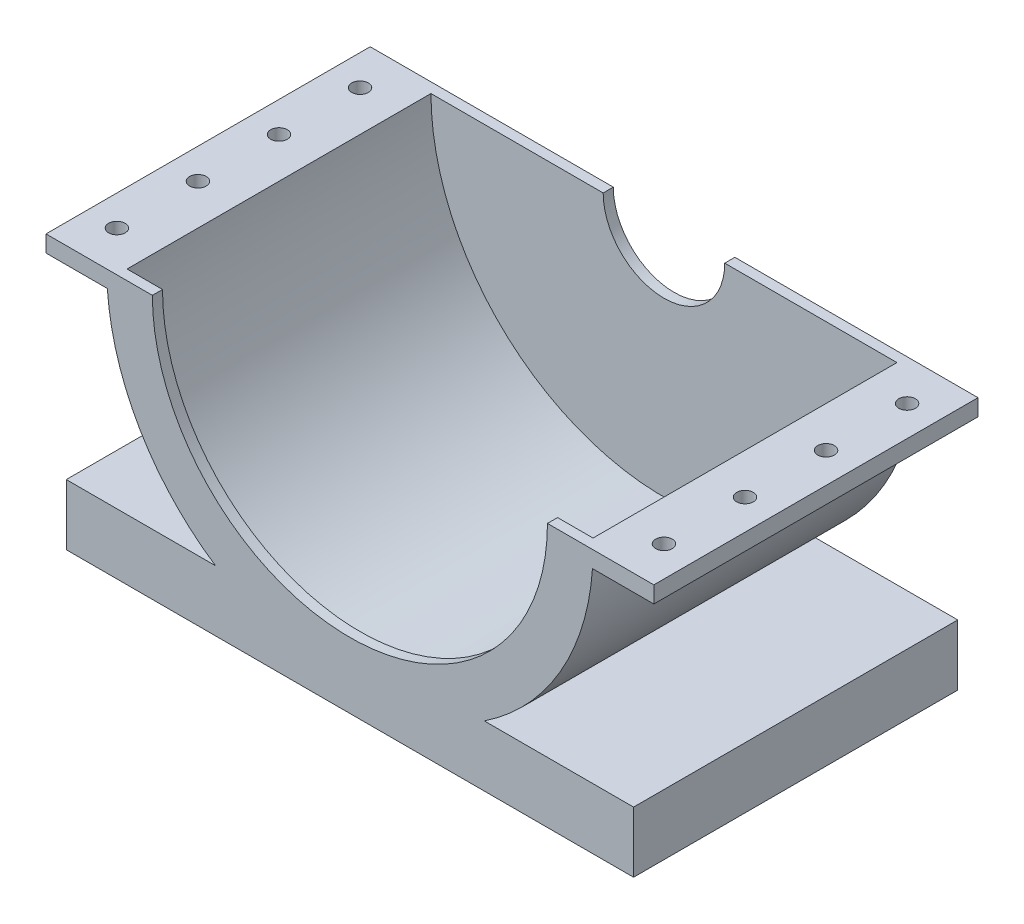
ISO-10303-21;
HEADER;
FILE_DESCRIPTION(('STEP AP214'),'2;1');
FILE_NAME('part.step','',(''),(''),'','','');
FILE_SCHEMA(('AUTOMOTIVE_DESIGN { 1 0 10303 214 1 1 1 1 }'));
ENDSEC;
DATA;
#1=APPLICATION_CONTEXT('core data for automotive mechanical design processes');
#2=APPLICATION_PROTOCOL_DEFINITION('international standard','automotive_design',2000,#1);
#3=PRODUCT_CONTEXT('',#1,'mechanical');
#4=PRODUCT('Part','Part','',(#3));
#5=PRODUCT_RELATED_PRODUCT_CATEGORY('part','',(#4));
#6=PRODUCT_DEFINITION_FORMATION('','',#4);
#7=PRODUCT_DEFINITION_CONTEXT('part definition',#1,'design');
#8=PRODUCT_DEFINITION('design','',#6,#7);
#9=PRODUCT_DEFINITION_SHAPE('','',#8);
#10=(LENGTH_UNIT() NAMED_UNIT(*) SI_UNIT(.MILLI.,.METRE.));
#11=(NAMED_UNIT(*) PLANE_ANGLE_UNIT() SI_UNIT($,.RADIAN.));
#12=(NAMED_UNIT(*) SI_UNIT($,.STERADIAN.) SOLID_ANGLE_UNIT());
#13=UNCERTAINTY_MEASURE_WITH_UNIT(LENGTH_MEASURE(1.E-05),#10,'distance_accuracy_value','');
#14=(GEOMETRIC_REPRESENTATION_CONTEXT(3) GLOBAL_UNCERTAINTY_ASSIGNED_CONTEXT((#13)) GLOBAL_UNIT_ASSIGNED_CONTEXT((#10,
#11,#12)) REPRESENTATION_CONTEXT('',''));
#15=CARTESIAN_POINT('',(0.,0.,0.));
#16=DIRECTION('',(0.,0.,1.));
#17=DIRECTION('',(1.,0.,0.));
#18=AXIS2_PLACEMENT_3D('',#15,#16,#17);
#19=CARTESIAN_POINT('',(0.,146.05,101.6));
#20=DIRECTION('',(0.,-1.,0.));
#21=DIRECTION('',(0.,0.,-1.));
#22=AXIS2_PLACEMENT_3D('',#19,#20,#21);
#23=PLANE('',#22);
#24=CARTESIAN_POINT('',(171.45,146.05,76.2));
#25=DIRECTION('',(0.,1.,0.));
#26=DIRECTION('',(0.,0.,-1.));
#27=AXIS2_PLACEMENT_3D('',#24,#25,#26);
#28=CIRCLE('',#27,5.20699999999998);
#29=CARTESIAN_POINT('',(171.45,146.05,70.993));
#30=VERTEX_POINT('',#29);
#31=EDGE_CURVE('E463',#30,#30,#28,.T.);
#32=ORIENTED_EDGE('',*,*,#31,.F.);
#33=EDGE_LOOP('',(#32));
#34=FACE_BOUND('',#33,.T.);
#35=CARTESIAN_POINT('',(171.45,146.05,25.4));
#36=DIRECTION('',(0.,1.,0.));
#37=DIRECTION('',(0.,0.,-1.));
#38=AXIS2_PLACEMENT_3D('',#35,#36,#37);
#39=CIRCLE('',#38,5.20699999999998);
#40=CARTESIAN_POINT('',(171.45,146.05,20.193));
#41=VERTEX_POINT('',#40);
#42=EDGE_CURVE('E468',#41,#41,#39,.T.);
#43=ORIENTED_EDGE('',*,*,#42,.F.);
#44=EDGE_LOOP('',(#43));
#45=FACE_BOUND('',#44,.T.);
#46=CARTESIAN_POINT('',(171.45,146.05,-25.4));
#47=DIRECTION('',(0.,1.,0.));
#48=DIRECTION('',(0.,0.,-1.));
#49=AXIS2_PLACEMENT_3D('',#46,#47,#48);
#50=CIRCLE('',#49,5.20699999999998);
#51=CARTESIAN_POINT('',(171.45,146.05,-30.607));
#52=VERTEX_POINT('',#51);
#53=EDGE_CURVE('E482',#52,#52,#50,.T.);
#54=ORIENTED_EDGE('',*,*,#53,.F.);
#55=EDGE_LOOP('',(#54));
#56=FACE_BOUND('',#55,.T.);
#57=CARTESIAN_POINT('',(171.45,146.05,-76.2));
#58=DIRECTION('',(0.,1.,0.));
#59=DIRECTION('',(0.,0.,-1.));
#60=AXIS2_PLACEMENT_3D('',#57,#58,#59);
#61=CIRCLE('',#60,5.20699999999998);
#62=CARTESIAN_POINT('',(171.45,146.05,-81.407));
#63=VERTEX_POINT('',#62);
#64=EDGE_CURVE('E478',#63,#63,#61,.T.);
#65=ORIENTED_EDGE('',*,*,#64,.F.);
#66=EDGE_LOOP('',(#65));
#67=FACE_BOUND('',#66,.T.);
#68=DIRECTION('',(-1.,0.,0.));
#69=VECTOR('',#68,1.);
#70=CARTESIAN_POINT('',(0.,146.05,-101.6));
#71=LINE('',#70,#69);
#72=CARTESIAN_POINT('',(190.5,146.05,-101.6));
#73=VERTEX_POINT('',#72);
#74=CARTESIAN_POINT('',(38.1,146.05,-101.6));
#75=VERTEX_POINT('',#74);
#76=EDGE_CURVE('E182',#73,#75,#71,.T.);
#77=ORIENTED_EDGE('',*,*,#76,.T.);
#78=DIRECTION('',(0.,0.,1.));
#79=VECTOR('',#78,1.);
#80=CARTESIAN_POINT('',(38.1,146.05,-101.6));
#81=LINE('',#80,#79);
#82=CARTESIAN_POINT('',(38.1,146.05,-95.25));
#83=VERTEX_POINT('',#82);
#84=EDGE_CURVE('E166',#75,#83,#81,.T.);
#85=ORIENTED_EDGE('',*,*,#84,.T.);
#86=DIRECTION('',(-1.,0.,0.));
#87=VECTOR('',#86,1.);
#88=CARTESIAN_POINT('',(-146.05,146.05,-95.25));
#89=LINE('',#88,#87);
#90=CARTESIAN_POINT('',(146.05,146.05,-95.25));
#91=VERTEX_POINT('',#90);
#92=EDGE_CURVE('E430',#91,#83,#89,.T.);
#93=ORIENTED_EDGE('',*,*,#92,.F.);
#94=DIRECTION('',(0.,0.,1.));
#95=VECTOR('',#94,1.);
#96=CARTESIAN_POINT('',(146.05,146.05,-95.25));
#97=LINE('',#96,#95);
#98=CARTESIAN_POINT('',(146.05,146.05,95.25));
#99=VERTEX_POINT('',#98);
#100=EDGE_CURVE('E388',#91,#99,#97,.T.);
#101=ORIENTED_EDGE('',*,*,#100,.T.);
#102=DIRECTION('',(-1.,0.,0.));
#103=VECTOR('',#102,1.);
#104=CARTESIAN_POINT('',(-146.05,146.05,95.25));
#105=LINE('',#104,#103);
#106=CARTESIAN_POINT('',(123.825,146.05,95.25));
#107=VERTEX_POINT('',#106);
#108=EDGE_CURVE('E432',#99,#107,#105,.T.);
#109=ORIENTED_EDGE('',*,*,#108,.T.);
#110=DIRECTION('',(0.,0.,1.));
#111=VECTOR('',#110,1.);
#112=CARTESIAN_POINT('',(123.825,146.05,-101.601));
#113=LINE('',#112,#111);
#114=CARTESIAN_POINT('',(123.825,146.05,101.6));
#115=VERTEX_POINT('',#114);
#116=EDGE_CURVE('E66',#115,#107,#113,.F.);
#117=ORIENTED_EDGE('',*,*,#116,.F.);
#118=DIRECTION('',(-1.,0.,0.));
#119=VECTOR('',#118,1.);
#120=CARTESIAN_POINT('',(0.,146.05,101.6));
#121=LINE('',#120,#119);
#122=CARTESIAN_POINT('',(190.5,146.05,101.6));
#123=VERTEX_POINT('',#122);
#124=EDGE_CURVE('E393',#123,#115,#121,.T.);
#125=ORIENTED_EDGE('',*,*,#124,.F.);
#126=DIRECTION('',(0.,0.,-1.));
#127=VECTOR('',#126,1.);
#128=CARTESIAN_POINT('',(190.5,146.05,101.6));
#129=LINE('',#128,#127);
#130=EDGE_CURVE('E189',#123,#73,#129,.T.);
#131=ORIENTED_EDGE('',*,*,#130,.T.);
#132=EDGE_LOOP('',(#77,#85,#93,#101,#109,#117,#125,#131));
#133=FACE_BOUND('',#132,.T.);
#134=ADVANCED_FACE('F41',(#34,#45,#56,#67,#133),#23,.F.);
#135=CARTESIAN_POINT('',(-171.45,146.05,-25.4));
#136=DIRECTION('',(0.,1.,0.));
#137=DIRECTION('',(0.,0.,1.));
#138=AXIS2_PLACEMENT_3D('',#135,#136,#137);
#139=CIRCLE('',#138,5.20699999999998);
#140=CARTESIAN_POINT('',(-171.45,146.05,-20.193));
#141=VERTEX_POINT('',#140);
#142=EDGE_CURVE('E462',#141,#141,#139,.T.);
#143=ORIENTED_EDGE('',*,*,#142,.F.);
#144=EDGE_LOOP('',(#143));
#145=FACE_BOUND('',#144,.T.);
#146=CARTESIAN_POINT('',(-171.45,146.05,25.4));
#147=DIRECTION('',(0.,1.,0.));
#148=DIRECTION('',(0.,0.,1.));
#149=AXIS2_PLACEMENT_3D('',#146,#147,#148);
#150=CIRCLE('',#149,5.20699999999998);
#151=CARTESIAN_POINT('',(-171.45,146.05,30.607));
#152=VERTEX_POINT('',#151);
#153=EDGE_CURVE('E472',#152,#152,#150,.T.);
#154=ORIENTED_EDGE('',*,*,#153,.F.);
#155=EDGE_LOOP('',(#154));
#156=FACE_BOUND('',#155,.T.);
#157=CARTESIAN_POINT('',(-171.45,146.05,76.2));
#158=DIRECTION('',(0.,1.,0.));
#159=DIRECTION('',(0.,0.,1.));
#160=AXIS2_PLACEMENT_3D('',#157,#158,#159);
#161=CIRCLE('',#160,5.20699999999998);
#162=CARTESIAN_POINT('',(-171.45,146.05,81.407));
#163=VERTEX_POINT('',#162);
#164=EDGE_CURVE('E467',#163,#163,#161,.T.);
#165=ORIENTED_EDGE('',*,*,#164,.F.);
#166=EDGE_LOOP('',(#165));
#167=FACE_BOUND('',#166,.T.);
#168=CARTESIAN_POINT('',(-171.45,146.05,-76.2));
#169=DIRECTION('',(0.,1.,0.));
#170=DIRECTION('',(0.,0.,1.));
#171=AXIS2_PLACEMENT_3D('',#168,#169,#170);
#172=CIRCLE('',#171,5.20699999999998);
#173=CARTESIAN_POINT('',(-171.45,146.05,-70.993));
#174=VERTEX_POINT('',#173);
#175=EDGE_CURVE('E248',#174,#174,#172,.T.);
#176=ORIENTED_EDGE('',*,*,#175,.F.);
#177=EDGE_LOOP('',(#176));
#178=FACE_BOUND('',#177,.T.);
#179=CARTESIAN_POINT('',(-38.1,146.05,-95.25));
#180=VERTEX_POINT('',#179);
#181=CARTESIAN_POINT('',(-146.05,146.05,-95.25));
#182=VERTEX_POINT('',#181);
#183=EDGE_CURVE('E444',#180,#182,#89,.T.);
#184=ORIENTED_EDGE('',*,*,#183,.F.);
#185=DIRECTION('',(0.,0.,1.));
#186=VECTOR('',#185,1.);
#187=CARTESIAN_POINT('',(-38.1,146.05,-101.6));
#188=LINE('',#187,#186);
#189=CARTESIAN_POINT('',(-38.1,146.05,-101.6));
#190=VERTEX_POINT('',#189);
#191=EDGE_CURVE('E58',#180,#190,#188,.F.);
#192=ORIENTED_EDGE('',*,*,#191,.T.);
#193=CARTESIAN_POINT('',(-190.5,146.05,-101.6));
#194=VERTEX_POINT('',#193);
#195=EDGE_CURVE('E185',#190,#194,#71,.T.);
#196=ORIENTED_EDGE('',*,*,#195,.T.);
#197=DIRECTION('',(0.,0.,-1.));
#198=VECTOR('',#197,1.);
#199=CARTESIAN_POINT('',(-190.5,146.05,101.6));
#200=LINE('',#199,#198);
#201=CARTESIAN_POINT('',(-190.5,146.05,101.6));
#202=VERTEX_POINT('',#201);
#203=EDGE_CURVE('E205',#202,#194,#200,.T.);
#204=ORIENTED_EDGE('',*,*,#203,.F.);
#205=CARTESIAN_POINT('',(-123.825,146.05,101.6));
#206=VERTEX_POINT('',#205);
#207=EDGE_CURVE('E397',#206,#202,#121,.T.);
#208=ORIENTED_EDGE('',*,*,#207,.F.);
#209=DIRECTION('',(0.,0.,1.));
#210=VECTOR('',#209,1.);
#211=CARTESIAN_POINT('',(-123.825,146.05,-101.601));
#212=LINE('',#211,#210);
#213=CARTESIAN_POINT('',(-123.825,146.05,95.25));
#214=VERTEX_POINT('',#213);
#215=EDGE_CURVE('E175',#214,#206,#212,.T.);
#216=ORIENTED_EDGE('',*,*,#215,.F.);
#217=CARTESIAN_POINT('',(-146.05,146.05,95.25));
#218=VERTEX_POINT('',#217);
#219=EDGE_CURVE('E437',#214,#218,#105,.T.);
#220=ORIENTED_EDGE('',*,*,#219,.T.);
#221=DIRECTION('',(0.,0.,1.));
#222=VECTOR('',#221,1.);
#223=CARTESIAN_POINT('',(-146.05,146.05,-95.25));
#224=LINE('',#223,#222);
#225=EDGE_CURVE('E382',#182,#218,#224,.T.);
#226=ORIENTED_EDGE('',*,*,#225,.F.);
#227=EDGE_LOOP('',(#184,#192,#196,#204,#208,#216,#220,#226));
#228=FACE_BOUND('',#227,.T.);
#229=ADVANCED_FACE('F291',(#145,#156,#167,#178,#228),#23,.F.);
#230=CARTESIAN_POINT('',(0.,135.636,101.6));
#231=DIRECTION('',(0.,1.,0.));
#232=DIRECTION('',(0.,0.,1.));
#233=AXIS2_PLACEMENT_3D('',#230,#231,#232);
#234=PLANE('',#233);
#235=CARTESIAN_POINT('',(-171.45,135.636,-25.4));
#236=DIRECTION('',(0.,1.,0.));
#237=DIRECTION('',(0.,0.,1.));
#238=AXIS2_PLACEMENT_3D('',#235,#236,#237);
#239=CIRCLE('',#238,5.20699999999998);
#240=CARTESIAN_POINT('',(-171.45,135.636,-20.193));
#241=VERTEX_POINT('',#240);
#242=EDGE_CURVE('E45',#241,#241,#239,.T.);
#243=ORIENTED_EDGE('',*,*,#242,.T.);
#244=EDGE_LOOP('',(#243));
#245=FACE_BOUND('',#244,.T.);
#246=CARTESIAN_POINT('',(-171.45,135.636,25.4));
#247=DIRECTION('',(0.,1.,0.));
#248=DIRECTION('',(0.,0.,1.));
#249=AXIS2_PLACEMENT_3D('',#246,#247,#248);
#250=CIRCLE('',#249,5.20699999999998);
#251=CARTESIAN_POINT('',(-171.45,135.636,30.607));
#252=VERTEX_POINT('',#251);
#253=EDGE_CURVE('E267',#252,#252,#250,.T.);
#254=ORIENTED_EDGE('',*,*,#253,.T.);
#255=EDGE_LOOP('',(#254));
#256=FACE_BOUND('',#255,.T.);
#257=CARTESIAN_POINT('',(-171.45,135.636,76.2));
#258=DIRECTION('',(0.,1.,0.));
#259=DIRECTION('',(0.,0.,1.));
#260=AXIS2_PLACEMENT_3D('',#257,#258,#259);
#261=CIRCLE('',#260,5.20699999999998);
#262=CARTESIAN_POINT('',(-171.45,135.636,81.407));
#263=VERTEX_POINT('',#262);
#264=EDGE_CURVE('E264',#263,#263,#261,.T.);
#265=ORIENTED_EDGE('',*,*,#264,.T.);
#266=EDGE_LOOP('',(#265));
#267=FACE_BOUND('',#266,.T.);
#268=CARTESIAN_POINT('',(-171.45,135.636,-76.2));
#269=DIRECTION('',(0.,1.,0.));
#270=DIRECTION('',(0.,0.,1.));
#271=AXIS2_PLACEMENT_3D('',#268,#269,#270);
#272=CIRCLE('',#271,5.20699999999998);
#273=CARTESIAN_POINT('',(-171.45,135.636,-70.993));
#274=VERTEX_POINT('',#273);
#275=EDGE_CURVE('E260',#274,#274,#272,.T.);
#276=ORIENTED_EDGE('',*,*,#275,.T.);
#277=EDGE_LOOP('',(#276));
#278=FACE_BOUND('',#277,.T.);
#279=DIRECTION('',(1.,0.,0.));
#280=VECTOR('',#279,1.);
#281=CARTESIAN_POINT('',(0.,135.636,-101.6));
#282=LINE('',#281,#280);
#283=CARTESIAN_POINT('',(-190.5,135.636,-101.6));
#284=VERTEX_POINT('',#283);
#285=CARTESIAN_POINT('',(-152.04377200004,135.636,-101.6));
#286=VERTEX_POINT('',#285);
#287=EDGE_CURVE('E379',#284,#286,#282,.T.);
#288=ORIENTED_EDGE('',*,*,#287,.T.);
#289=DIRECTION('',(0.,0.,-1.));
#290=VECTOR('',#289,1.);
#291=CARTESIAN_POINT('',(-152.04377200004,135.636,101.6));
#292=LINE('',#291,#290);
#293=CARTESIAN_POINT('',(-152.04377200004,135.636,101.6));
#294=VERTEX_POINT('',#293);
#295=EDGE_CURVE('E51',#294,#286,#292,.T.);
#296=ORIENTED_EDGE('',*,*,#295,.F.);
#297=DIRECTION('',(1.,0.,0.));
#298=VECTOR('',#297,1.);
#299=CARTESIAN_POINT('',(0.,135.636,101.6));
#300=LINE('',#299,#298);
#301=CARTESIAN_POINT('',(-190.5,135.636,101.6));
#302=VERTEX_POINT('',#301);
#303=EDGE_CURVE('E195',#302,#294,#300,.T.);
#304=ORIENTED_EDGE('',*,*,#303,.F.);
#305=DIRECTION('',(0.,0.,-1.));
#306=VECTOR('',#305,1.);
#307=CARTESIAN_POINT('',(-190.5,135.636,101.6));
#308=LINE('',#307,#306);
#309=EDGE_CURVE('E201',#302,#284,#308,.T.);
#310=ORIENTED_EDGE('',*,*,#309,.T.);
#311=EDGE_LOOP('',(#288,#296,#304,#310));
#312=FACE_BOUND('',#311,.T.);
#313=ADVANCED_FACE('F43',(#245,#256,#267,#278,#312),#234,.F.);
#314=CARTESIAN_POINT('',(0.,146.05,101.6));
#315=DIRECTION('',(0.,0.,-1.));
#316=DIRECTION('',(-1.,0.,0.));
#317=AXIS2_PLACEMENT_3D('',#314,#315,#316);
#318=CYLINDRICAL_SURFACE('',#317,152.4);
#319=CARTESIAN_POINT('',(0.,146.05,-101.6));
#320=DIRECTION('',(0.,0.,1.));
#321=DIRECTION('',(1.,0.,0.));
#322=AXIS2_PLACEMENT_3D('',#319,#320,#321);
#323=CIRCLE('',#322,152.4);
#324=CARTESIAN_POINT('',(-84.2422696750272,19.05,-101.6));
#325=VERTEX_POINT('',#324);
#326=EDGE_CURVE('E348',#286,#325,#323,.T.);
#327=ORIENTED_EDGE('',*,*,#326,.T.);
#328=DIRECTION('',(0.,0.,-1.));
#329=VECTOR('',#328,1.);
#330=CARTESIAN_POINT('',(-84.2422696750272,19.05,101.6));
#331=LINE('',#330,#329);
#332=CARTESIAN_POINT('',(-84.2422696750272,19.05,101.6));
#333=VERTEX_POINT('',#332);
#334=EDGE_CURVE('E236',#333,#325,#331,.T.);
#335=ORIENTED_EDGE('',*,*,#334,.F.);
#336=CARTESIAN_POINT('',(0.,146.05,101.6));
#337=DIRECTION('',(0.,0.,1.));
#338=DIRECTION('',(1.,0.,0.));
#339=AXIS2_PLACEMENT_3D('',#336,#337,#338);
#340=CIRCLE('',#339,152.4);
#341=EDGE_CURVE('E422',#294,#333,#340,.T.);
#342=ORIENTED_EDGE('',*,*,#341,.F.);
#343=ORIENTED_EDGE('',*,*,#295,.T.);
#344=EDGE_LOOP('',(#327,#335,#342,#343));
#345=FACE_BOUND('',#344,.T.);
#346=ADVANCED_FACE('F317',(#345),#318,.T.);
#347=CARTESIAN_POINT('',(0.,19.05,101.6));
#348=DIRECTION('',(0.,-1.,0.));
#349=DIRECTION('',(1.,0.,0.));
#350=AXIS2_PLACEMENT_3D('',#347,#348,#349);
#351=PLANE('',#350);
#352=DIRECTION('',(-1.,0.,0.));
#353=VECTOR('',#352,1.);
#354=CARTESIAN_POINT('',(0.,19.05,-101.6));
#355=LINE('',#354,#353);
#356=CARTESIAN_POINT('',(-177.8,19.05,-101.6));
#357=VERTEX_POINT('',#356);
#358=EDGE_CURVE('E341',#325,#357,#355,.T.);
#359=ORIENTED_EDGE('',*,*,#358,.T.);
#360=DIRECTION('',(0.,0.,-1.));
#361=VECTOR('',#360,1.);
#362=CARTESIAN_POINT('',(-177.8,19.05,101.6));
#363=LINE('',#362,#361);
#364=CARTESIAN_POINT('',(-177.8,19.05,101.6));
#365=VERTEX_POINT('',#364);
#366=EDGE_CURVE('E232',#365,#357,#363,.T.);
#367=ORIENTED_EDGE('',*,*,#366,.F.);
#368=DIRECTION('',(-1.,0.,0.));
#369=VECTOR('',#368,1.);
#370=CARTESIAN_POINT('',(0.,19.05,101.6));
#371=LINE('',#370,#369);
#372=EDGE_CURVE('E419',#333,#365,#371,.T.);
#373=ORIENTED_EDGE('',*,*,#372,.F.);
#374=ORIENTED_EDGE('',*,*,#334,.T.);
#375=EDGE_LOOP('',(#359,#367,#373,#374));
#376=FACE_BOUND('',#375,.T.);
#377=ADVANCED_FACE('F331',(#376),#351,.F.);
#378=CARTESIAN_POINT('',(-177.8,-1.29526019539602E-13,101.6));
#379=DIRECTION('',(1.,0.,0.));
#380=DIRECTION('',(0.,1.,0.));
#381=AXIS2_PLACEMENT_3D('',#378,#379,#380);
#382=PLANE('',#381);
#383=DIRECTION('',(0.,-1.,0.));
#384=VECTOR('',#383,1.);
#385=CARTESIAN_POINT('',(-177.8,-1.29526019539602E-13,-101.6));
#386=LINE('',#385,#384);
#387=CARTESIAN_POINT('',(-177.8,-19.05,-101.6));
#388=VERTEX_POINT('',#387);
#389=EDGE_CURVE('E347',#357,#388,#386,.T.);
#390=ORIENTED_EDGE('',*,*,#389,.T.);
#391=DIRECTION('',(0.,0.,-1.));
#392=VECTOR('',#391,1.);
#393=CARTESIAN_POINT('',(-177.8,-19.05,101.6));
#394=LINE('',#393,#392);
#395=CARTESIAN_POINT('',(-177.8,-19.05,101.6));
#396=VERTEX_POINT('',#395);
#397=EDGE_CURVE('E228',#396,#388,#394,.T.);
#398=ORIENTED_EDGE('',*,*,#397,.F.);
#399=DIRECTION('',(0.,-1.,0.));
#400=VECTOR('',#399,1.);
#401=CARTESIAN_POINT('',(-177.8,-1.29526019539602E-13,101.6));
#402=LINE('',#401,#400);
#403=EDGE_CURVE('E351',#365,#396,#402,.T.);
#404=ORIENTED_EDGE('',*,*,#403,.F.);
#405=ORIENTED_EDGE('',*,*,#366,.T.);
#406=EDGE_LOOP('',(#390,#398,#404,#405));
#407=FACE_BOUND('',#406,.T.);
#408=ADVANCED_FACE('F328',(#407),#382,.F.);
#409=CARTESIAN_POINT('',(0.,-19.05,101.6));
#410=DIRECTION('',(0.,1.,0.));
#411=DIRECTION('',(0.,0.,1.));
#412=AXIS2_PLACEMENT_3D('',#409,#410,#411);
#413=PLANE('',#412);
#414=DIRECTION('',(1.,0.,0.));
#415=VECTOR('',#414,1.);
#416=CARTESIAN_POINT('',(0.,-19.05,-101.6));
#417=LINE('',#416,#415);
#418=CARTESIAN_POINT('',(177.8,-19.05,-101.6));
#419=VERTEX_POINT('',#418);
#420=EDGE_CURVE('E355',#388,#419,#417,.T.);
#421=ORIENTED_EDGE('',*,*,#420,.T.);
#422=DIRECTION('',(0.,0.,-1.));
#423=VECTOR('',#422,1.);
#424=CARTESIAN_POINT('',(177.8,-19.05,101.6));
#425=LINE('',#424,#423);
#426=CARTESIAN_POINT('',(177.8,-19.05,101.6));
#427=VERTEX_POINT('',#426);
#428=EDGE_CURVE('E225',#427,#419,#425,.T.);
#429=ORIENTED_EDGE('',*,*,#428,.F.);
#430=DIRECTION('',(1.,0.,0.));
#431=VECTOR('',#430,1.);
#432=CARTESIAN_POINT('',(0.,-19.05,101.6));
#433=LINE('',#432,#431);
#434=EDGE_CURVE('E414',#396,#427,#433,.T.);
#435=ORIENTED_EDGE('',*,*,#434,.F.);
#436=ORIENTED_EDGE('',*,*,#397,.T.);
#437=EDGE_LOOP('',(#421,#429,#435,#436));
#438=FACE_BOUND('',#437,.T.);
#439=ADVANCED_FACE('F324',(#438),#413,.F.);
#440=CARTESIAN_POINT('',(177.8,-1.29526019539602E-13,101.6));
#441=DIRECTION('',(1.,0.,0.));
#442=DIRECTION('',(0.,1.,0.));
#443=AXIS2_PLACEMENT_3D('',#440,#441,#442);
#444=PLANE('',#443);
#445=DIRECTION('',(0.,-1.,0.));
#446=VECTOR('',#445,1.);
#447=CARTESIAN_POINT('',(177.8,-1.29526019539602E-13,-101.6));
#448=LINE('',#447,#446);
#449=CARTESIAN_POINT('',(177.8,19.05,-101.6));
#450=VERTEX_POINT('',#449);
#451=EDGE_CURVE('E359',#450,#419,#448,.T.);
#452=ORIENTED_EDGE('',*,*,#451,.F.);
#453=DIRECTION('',(0.,0.,-1.));
#454=VECTOR('',#453,1.);
#455=CARTESIAN_POINT('',(177.8,19.05,101.6));
#456=LINE('',#455,#454);
#457=CARTESIAN_POINT('',(177.8,19.05,101.6));
#458=VERTEX_POINT('',#457);
#459=EDGE_CURVE('E222',#458,#450,#456,.T.);
#460=ORIENTED_EDGE('',*,*,#459,.F.);
#461=DIRECTION('',(0.,-1.,0.));
#462=VECTOR('',#461,1.);
#463=CARTESIAN_POINT('',(177.8,-1.29526019539602E-13,101.6));
#464=LINE('',#463,#462);
#465=EDGE_CURVE('E410',#458,#427,#464,.T.);
#466=ORIENTED_EDGE('',*,*,#465,.T.);
#467=ORIENTED_EDGE('',*,*,#428,.T.);
#468=EDGE_LOOP('',(#452,#460,#466,#467));
#469=FACE_BOUND('',#468,.T.);
#470=ADVANCED_FACE('F320',(#469),#444,.T.);
#471=CARTESIAN_POINT('',(0.,19.05,101.6));
#472=DIRECTION('',(0.,-1.,0.));
#473=DIRECTION('',(1.,0.,0.));
#474=AXIS2_PLACEMENT_3D('',#471,#472,#473);
#475=PLANE('',#474);
#476=DIRECTION('',(-1.,0.,0.));
#477=VECTOR('',#476,1.);
#478=CARTESIAN_POINT('',(0.,19.05,-101.6));
#479=LINE('',#478,#477);
#480=CARTESIAN_POINT('',(84.2422696750271,19.05,-101.6));
#481=VERTEX_POINT('',#480);
#482=EDGE_CURVE('E365',#450,#481,#479,.T.);
#483=ORIENTED_EDGE('',*,*,#482,.T.);
#484=DIRECTION('',(0.,0.,-1.));
#485=VECTOR('',#484,1.);
#486=CARTESIAN_POINT('',(84.2422696750271,19.05,101.6));
#487=LINE('',#486,#485);
#488=CARTESIAN_POINT('',(84.2422696750271,19.05,101.6));
#489=VERTEX_POINT('',#488);
#490=EDGE_CURVE('E218',#489,#481,#487,.T.);
#491=ORIENTED_EDGE('',*,*,#490,.F.);
#492=DIRECTION('',(-1.,0.,0.));
#493=VECTOR('',#492,1.);
#494=CARTESIAN_POINT('',(0.,19.05,101.6));
#495=LINE('',#494,#493);
#496=EDGE_CURVE('E407',#458,#489,#495,.T.);
#497=ORIENTED_EDGE('',*,*,#496,.F.);
#498=ORIENTED_EDGE('',*,*,#459,.T.);
#499=EDGE_LOOP('',(#483,#491,#497,#498));
#500=FACE_BOUND('',#499,.T.);
#501=ADVANCED_FACE('F315',(#500),#475,.F.);
#502=CARTESIAN_POINT('',(152.043772000039,135.636,-101.6));
#503=VERTEX_POINT('',#502);
#504=EDGE_CURVE('E367',#481,#503,#323,.T.);
#505=ORIENTED_EDGE('',*,*,#504,.T.);
#506=DIRECTION('',(0.,0.,-1.));
#507=VECTOR('',#506,1.);
#508=CARTESIAN_POINT('',(152.043772000039,135.636,101.6));
#509=LINE('',#508,#507);
#510=CARTESIAN_POINT('',(152.043772000039,135.636,101.6));
#511=VERTEX_POINT('',#510);
#512=EDGE_CURVE('E215',#511,#503,#509,.T.);
#513=ORIENTED_EDGE('',*,*,#512,.F.);
#514=EDGE_CURVE('E406',#489,#511,#340,.T.);
#515=ORIENTED_EDGE('',*,*,#514,.F.);
#516=ORIENTED_EDGE('',*,*,#490,.T.);
#517=EDGE_LOOP('',(#505,#513,#515,#516));
#518=FACE_BOUND('',#517,.T.);
#519=ADVANCED_FACE('F311',(#518),#318,.T.);
#520=CARTESIAN_POINT('',(0.,135.636,101.6));
#521=DIRECTION('',(0.,-1.,0.));
#522=DIRECTION('',(1.,0.,0.));
#523=AXIS2_PLACEMENT_3D('',#520,#521,#522);
#524=PLANE('',#523);
#525=CARTESIAN_POINT('',(171.45,135.636,76.2));
#526=DIRECTION('',(0.,-1.,0.));
#527=DIRECTION('',(1.,0.,0.));
#528=AXIS2_PLACEMENT_3D('',#525,#526,#527);
#529=CIRCLE('',#528,5.20699999999998);
#530=CARTESIAN_POINT('',(176.657,135.636,76.2));
#531=VERTEX_POINT('',#530);
#532=EDGE_CURVE('E256',#531,#531,#529,.T.);
#533=ORIENTED_EDGE('',*,*,#532,.F.);
#534=EDGE_LOOP('',(#533));
#535=FACE_BOUND('',#534,.T.);
#536=CARTESIAN_POINT('',(171.45,135.636,25.4));
#537=DIRECTION('',(0.,-1.,0.));
#538=DIRECTION('',(1.,0.,0.));
#539=AXIS2_PLACEMENT_3D('',#536,#537,#538);
#540=CIRCLE('',#539,5.20699999999998);
#541=CARTESIAN_POINT('',(176.657,135.636,25.4));
#542=VERTEX_POINT('',#541);
#543=EDGE_CURVE('E252',#542,#542,#540,.T.);
#544=ORIENTED_EDGE('',*,*,#543,.F.);
#545=EDGE_LOOP('',(#544));
#546=FACE_BOUND('',#545,.T.);
#547=CARTESIAN_POINT('',(171.45,135.636,-25.4));
#548=DIRECTION('',(0.,-1.,0.));
#549=DIRECTION('',(1.,0.,0.));
#550=AXIS2_PLACEMENT_3D('',#547,#548,#549);
#551=CIRCLE('',#550,5.20699999999998);
#552=CARTESIAN_POINT('',(176.657,135.636,-25.4));
#553=VERTEX_POINT('',#552);
#554=EDGE_CURVE('E247',#553,#553,#551,.T.);
#555=ORIENTED_EDGE('',*,*,#554,.F.);
#556=EDGE_LOOP('',(#555));
#557=FACE_BOUND('',#556,.T.);
#558=CARTESIAN_POINT('',(171.45,135.636,-76.2));
#559=DIRECTION('',(0.,-1.,0.));
#560=DIRECTION('',(1.,0.,0.));
#561=AXIS2_PLACEMENT_3D('',#558,#559,#560);
#562=CIRCLE('',#561,5.20699999999998);
#563=CARTESIAN_POINT('',(176.657,135.636,-76.2));
#564=VERTEX_POINT('',#563);
#565=EDGE_CURVE('E243',#564,#564,#562,.T.);
#566=ORIENTED_EDGE('',*,*,#565,.F.);
#567=EDGE_LOOP('',(#566));
#568=FACE_BOUND('',#567,.T.);
#569=DIRECTION('',(-1.,0.,0.));
#570=VECTOR('',#569,1.);
#571=CARTESIAN_POINT('',(0.,135.636,-101.6));
#572=LINE('',#571,#570);
#573=CARTESIAN_POINT('',(190.5,135.636,-101.6));
#574=VERTEX_POINT('',#573);
#575=EDGE_CURVE('E368',#574,#503,#572,.T.);
#576=ORIENTED_EDGE('',*,*,#575,.F.);
#577=DIRECTION('',(0.,0.,-1.));
#578=VECTOR('',#577,1.);
#579=CARTESIAN_POINT('',(190.5,135.636,101.6));
#580=LINE('',#579,#578);
#581=CARTESIAN_POINT('',(190.5,135.636,101.6));
#582=VERTEX_POINT('',#581);
#583=EDGE_CURVE('E212',#582,#574,#580,.T.);
#584=ORIENTED_EDGE('',*,*,#583,.F.);
#585=DIRECTION('',(-1.,0.,0.));
#586=VECTOR('',#585,1.);
#587=CARTESIAN_POINT('',(0.,135.636,101.6));
#588=LINE('',#587,#586);
#589=EDGE_CURVE('E402',#582,#511,#588,.T.);
#590=ORIENTED_EDGE('',*,*,#589,.T.);
#591=ORIENTED_EDGE('',*,*,#512,.T.);
#592=EDGE_LOOP('',(#576,#584,#590,#591));
#593=FACE_BOUND('',#592,.T.);
#594=ADVANCED_FACE('F307',(#535,#546,#557,#568,#593),#524,.T.);
#595=CARTESIAN_POINT('',(190.5,0.,101.6));
#596=DIRECTION('',(1.,0.,0.));
#597=DIRECTION('',(0.,0.,-1.));
#598=AXIS2_PLACEMENT_3D('',#595,#596,#597);
#599=PLANE('',#598);
#600=DIRECTION('',(0.,-1.,0.));
#601=VECTOR('',#600,1.);
#602=CARTESIAN_POINT('',(190.5,0.,-101.6));
#603=LINE('',#602,#601);
#604=EDGE_CURVE('E197',#73,#574,#603,.T.);
#605=ORIENTED_EDGE('',*,*,#604,.F.);
#606=ORIENTED_EDGE('',*,*,#130,.F.);
#607=DIRECTION('',(0.,-1.,0.));
#608=VECTOR('',#607,1.);
#609=CARTESIAN_POINT('',(190.5,0.,101.6));
#610=LINE('',#609,#608);
#611=EDGE_CURVE('E398',#123,#582,#610,.T.);
#612=ORIENTED_EDGE('',*,*,#611,.T.);
#613=ORIENTED_EDGE('',*,*,#583,.T.);
#614=EDGE_LOOP('',(#605,#606,#612,#613));
#615=FACE_BOUND('',#614,.T.);
#616=ADVANCED_FACE('F304',(#615),#599,.T.);
#617=CARTESIAN_POINT('',(-190.5,0.,101.6));
#618=DIRECTION('',(1.,0.,0.));
#619=DIRECTION('',(0.,0.,-1.));
#620=AXIS2_PLACEMENT_3D('',#617,#618,#619);
#621=PLANE('',#620);
#622=DIRECTION('',(0.,-1.,0.));
#623=VECTOR('',#622,1.);
#624=CARTESIAN_POINT('',(-190.5,0.,-101.6));
#625=LINE('',#624,#623);
#626=EDGE_CURVE('E191',#194,#284,#625,.T.);
#627=ORIENTED_EDGE('',*,*,#626,.T.);
#628=ORIENTED_EDGE('',*,*,#309,.F.);
#629=DIRECTION('',(0.,-1.,0.));
#630=VECTOR('',#629,1.);
#631=CARTESIAN_POINT('',(-190.5,0.,101.6));
#632=LINE('',#631,#630);
#633=EDGE_CURVE('E206',#202,#302,#632,.T.);
#634=ORIENTED_EDGE('',*,*,#633,.F.);
#635=ORIENTED_EDGE('',*,*,#203,.T.);
#636=EDGE_LOOP('',(#627,#628,#634,#635));
#637=FACE_BOUND('',#636,.T.);
#638=ADVANCED_FACE('F302',(#637),#621,.F.);
#639=CARTESIAN_POINT('',(0.,0.,101.6));
#640=DIRECTION('',(0.,0.,1.));
#641=DIRECTION('',(1.,0.,0.));
#642=AXIS2_PLACEMENT_3D('',#639,#640,#641);
#643=PLANE('',#642);
#644=CARTESIAN_POINT('',(0.,146.05,101.6));
#645=DIRECTION('',(0.,0.,1.));
#646=DIRECTION('',(1.,0.,0.));
#647=AXIS2_PLACEMENT_3D('',#644,#645,#646);
#648=CIRCLE('',#647,123.825);
#649=EDGE_CURVE('E450',#206,#115,#648,.T.);
#650=ORIENTED_EDGE('',*,*,#649,.F.);
#651=ORIENTED_EDGE('',*,*,#207,.T.);
#652=ORIENTED_EDGE('',*,*,#633,.T.);
#653=ORIENTED_EDGE('',*,*,#303,.T.);
#654=ORIENTED_EDGE('',*,*,#341,.T.);
#655=ORIENTED_EDGE('',*,*,#372,.T.);
#656=ORIENTED_EDGE('',*,*,#403,.T.);
#657=ORIENTED_EDGE('',*,*,#434,.T.);
#658=ORIENTED_EDGE('',*,*,#465,.F.);
#659=ORIENTED_EDGE('',*,*,#496,.T.);
#660=ORIENTED_EDGE('',*,*,#514,.T.);
#661=ORIENTED_EDGE('',*,*,#589,.F.);
#662=ORIENTED_EDGE('',*,*,#611,.F.);
#663=ORIENTED_EDGE('',*,*,#124,.T.);
#664=EDGE_LOOP('',(#650,#651,#652,#653,#654,#655,#656,#657,#658,#659,#660,#661,#662,#663));
#665=FACE_BOUND('',#664,.T.);
#666=ADVANCED_FACE('F529',(#665),#643,.T.);
#667=CARTESIAN_POINT('',(0.,0.,-101.6));
#668=DIRECTION('',(0.,0.,1.));
#669=DIRECTION('',(1.,0.,0.));
#670=AXIS2_PLACEMENT_3D('',#667,#668,#669);
#671=PLANE('',#670);
#672=ORIENTED_EDGE('',*,*,#195,.F.);
#673=CARTESIAN_POINT('',(0.,146.05,-101.6));
#674=DIRECTION('',(0.,0.,1.));
#675=DIRECTION('',(1.,0.,0.));
#676=AXIS2_PLACEMENT_3D('',#673,#674,#675);
#677=CIRCLE('',#676,38.1);
#678=EDGE_CURVE('E169',#190,#75,#677,.T.);
#679=ORIENTED_EDGE('',*,*,#678,.T.);
#680=ORIENTED_EDGE('',*,*,#76,.F.);
#681=ORIENTED_EDGE('',*,*,#604,.T.);
#682=ORIENTED_EDGE('',*,*,#575,.T.);
#683=ORIENTED_EDGE('',*,*,#504,.F.);
#684=ORIENTED_EDGE('',*,*,#482,.F.);
#685=ORIENTED_EDGE('',*,*,#451,.T.);
#686=ORIENTED_EDGE('',*,*,#420,.F.);
#687=ORIENTED_EDGE('',*,*,#389,.F.);
#688=ORIENTED_EDGE('',*,*,#358,.F.);
#689=ORIENTED_EDGE('',*,*,#326,.F.);
#690=ORIENTED_EDGE('',*,*,#287,.F.);
#691=ORIENTED_EDGE('',*,*,#626,.F.);
#692=EDGE_LOOP('',(#672,#679,#680,#681,#682,#683,#684,#685,#686,#687,#688,#689,#690,#691));
#693=FACE_BOUND('',#692,.T.);
#694=ADVANCED_FACE('F180',(#693),#671,.F.);
#695=CARTESIAN_POINT('',(0.,146.05,-95.25));
#696=DIRECTION('',(0.,0.,1.));
#697=DIRECTION('',(1.,0.,0.));
#698=AXIS2_PLACEMENT_3D('',#695,#696,#697);
#699=CYLINDRICAL_SURFACE('',#698,146.05);
#700=CARTESIAN_POINT('',(0.,146.05,95.25));
#701=DIRECTION('',(0.,0.,1.));
#702=DIRECTION('',(1.,0.,0.));
#703=AXIS2_PLACEMENT_3D('',#700,#701,#702);
#704=CIRCLE('',#703,146.05);
#705=EDGE_CURVE('E438',#218,#99,#704,.T.);
#706=ORIENTED_EDGE('',*,*,#705,.T.);
#707=ORIENTED_EDGE('',*,*,#100,.F.);
#708=CARTESIAN_POINT('',(0.,146.05,-95.25));
#709=DIRECTION('',(0.,0.,1.));
#710=DIRECTION('',(1.,0.,0.));
#711=AXIS2_PLACEMENT_3D('',#708,#709,#710);
#712=CIRCLE('',#711,146.05);
#713=EDGE_CURVE('E436',#182,#91,#712,.T.);
#714=ORIENTED_EDGE('',*,*,#713,.F.);
#715=ORIENTED_EDGE('',*,*,#225,.T.);
#716=EDGE_LOOP('',(#706,#707,#714,#715));
#717=FACE_BOUND('',#716,.T.);
#718=ADVANCED_FACE('F614',(#717),#699,.F.);
#719=CARTESIAN_POINT('',(0.,146.05,-95.25));
#720=DIRECTION('',(0.,0.,1.));
#721=DIRECTION('',(1.,0.,0.));
#722=AXIS2_PLACEMENT_3D('',#719,#720,#721);
#723=PLANE('',#722);
#724=CARTESIAN_POINT('',(0.,146.05,-95.25));
#725=DIRECTION('',(0.,0.,1.));
#726=DIRECTION('',(1.,0.,0.));
#727=AXIS2_PLACEMENT_3D('',#724,#725,#726);
#728=CIRCLE('',#727,38.1);
#729=EDGE_CURVE('E11',#180,#83,#728,.T.);
#730=ORIENTED_EDGE('',*,*,#729,.F.);
#731=ORIENTED_EDGE('',*,*,#183,.T.);
#732=ORIENTED_EDGE('',*,*,#713,.T.);
#733=ORIENTED_EDGE('',*,*,#92,.T.);
#734=EDGE_LOOP('',(#730,#731,#732,#733));
#735=FACE_BOUND('',#734,.T.);
#736=ADVANCED_FACE('F619',(#735),#723,.T.);
#737=CARTESIAN_POINT('',(0.,146.05,95.25));
#738=DIRECTION('',(0.,0.,1.));
#739=DIRECTION('',(1.,0.,0.));
#740=AXIS2_PLACEMENT_3D('',#737,#738,#739);
#741=PLANE('',#740);
#742=ORIENTED_EDGE('',*,*,#219,.F.);
#743=CARTESIAN_POINT('',(0.,146.05,95.25));
#744=DIRECTION('',(0.,0.,1.));
#745=DIRECTION('',(1.,0.,0.));
#746=AXIS2_PLACEMENT_3D('',#743,#744,#745);
#747=CIRCLE('',#746,123.825);
#748=EDGE_CURVE('E441',#107,#214,#747,.F.);
#749=ORIENTED_EDGE('',*,*,#748,.F.);
#750=ORIENTED_EDGE('',*,*,#108,.F.);
#751=ORIENTED_EDGE('',*,*,#705,.F.);
#752=EDGE_LOOP('',(#742,#749,#750,#751));
#753=FACE_BOUND('',#752,.T.);
#754=ADVANCED_FACE('F637',(#753),#741,.F.);
#755=CARTESIAN_POINT('',(0.,146.05,-101.601));
#756=DIRECTION('',(0.,0.,1.));
#757=DIRECTION('',(1.,0.,0.));
#758=AXIS2_PLACEMENT_3D('',#755,#756,#757);
#759=CYLINDRICAL_SURFACE('',#758,123.825);
#760=ORIENTED_EDGE('',*,*,#116,.T.);
#761=ORIENTED_EDGE('',*,*,#748,.T.);
#762=ORIENTED_EDGE('',*,*,#215,.T.);
#763=ORIENTED_EDGE('',*,*,#649,.T.);
#764=EDGE_LOOP('',(#760,#761,#762,#763));
#765=FACE_BOUND('',#764,.T.);
#766=ADVANCED_FACE('F506',(#765),#759,.F.);
#767=CARTESIAN_POINT('',(0.,146.05,-101.6));
#768=DIRECTION('',(0.,0.,1.));
#769=DIRECTION('',(1.,0.,0.));
#770=AXIS2_PLACEMENT_3D('',#767,#768,#769);
#771=CYLINDRICAL_SURFACE('',#770,38.1);
#772=ORIENTED_EDGE('',*,*,#678,.F.);
#773=ORIENTED_EDGE('',*,*,#191,.F.);
#774=ORIENTED_EDGE('',*,*,#729,.T.);
#775=ORIENTED_EDGE('',*,*,#84,.F.);
#776=EDGE_LOOP('',(#772,#773,#774,#775));
#777=FACE_BOUND('',#776,.T.);
#778=ADVANCED_FACE('F168',(#777),#771,.F.);
#779=CARTESIAN_POINT('',(171.45,62.484,-76.2));
#780=DIRECTION('',(0.,1.,0.));
#781=DIRECTION('',(0.,0.,1.));
#782=AXIS2_PLACEMENT_3D('',#779,#780,#781);
#783=CYLINDRICAL_SURFACE('',#782,5.20699999999998);
#784=ORIENTED_EDGE('',*,*,#565,.T.);
#785=EDGE_LOOP('',(#784));
#786=FACE_BOUND('',#785,.T.);
#787=ORIENTED_EDGE('',*,*,#64,.T.);
#788=EDGE_LOOP('',(#787));
#789=FACE_BOUND('',#788,.T.);
#790=ADVANCED_FACE('F496',(#786,#789),#783,.F.);
#791=CARTESIAN_POINT('',(171.45,62.484,-25.4));
#792=DIRECTION('',(0.,1.,0.));
#793=DIRECTION('',(0.,0.,1.));
#794=AXIS2_PLACEMENT_3D('',#791,#792,#793);
#795=CYLINDRICAL_SURFACE('',#794,5.20699999999998);
#796=ORIENTED_EDGE('',*,*,#554,.T.);
#797=EDGE_LOOP('',(#796));
#798=FACE_BOUND('',#797,.T.);
#799=ORIENTED_EDGE('',*,*,#53,.T.);
#800=EDGE_LOOP('',(#799));
#801=FACE_BOUND('',#800,.T.);
#802=ADVANCED_FACE('F498',(#798,#801),#795,.F.);
#803=CARTESIAN_POINT('',(171.45,62.484,25.4));
#804=DIRECTION('',(0.,1.,0.));
#805=DIRECTION('',(0.,0.,1.));
#806=AXIS2_PLACEMENT_3D('',#803,#804,#805);
#807=CYLINDRICAL_SURFACE('',#806,5.20699999999998);
#808=ORIENTED_EDGE('',*,*,#543,.T.);
#809=EDGE_LOOP('',(#808));
#810=FACE_BOUND('',#809,.T.);
#811=ORIENTED_EDGE('',*,*,#42,.T.);
#812=EDGE_LOOP('',(#811));
#813=FACE_BOUND('',#812,.T.);
#814=ADVANCED_FACE('F490',(#810,#813),#807,.F.);
#815=CARTESIAN_POINT('',(171.45,62.484,76.2));
#816=DIRECTION('',(0.,1.,0.));
#817=DIRECTION('',(0.,0.,1.));
#818=AXIS2_PLACEMENT_3D('',#815,#816,#817);
#819=CYLINDRICAL_SURFACE('',#818,5.20699999999998);
#820=ORIENTED_EDGE('',*,*,#532,.T.);
#821=EDGE_LOOP('',(#820));
#822=FACE_BOUND('',#821,.T.);
#823=ORIENTED_EDGE('',*,*,#31,.T.);
#824=EDGE_LOOP('',(#823));
#825=FACE_BOUND('',#824,.T.);
#826=ADVANCED_FACE('F510',(#822,#825),#819,.F.);
#827=CARTESIAN_POINT('',(-171.45,62.484,-76.2));
#828=DIRECTION('',(0.,1.,0.));
#829=DIRECTION('',(0.,0.,1.));
#830=AXIS2_PLACEMENT_3D('',#827,#828,#829);
#831=CYLINDRICAL_SURFACE('',#830,5.20699999999998);
#832=ORIENTED_EDGE('',*,*,#175,.T.);
#833=EDGE_LOOP('',(#832));
#834=FACE_BOUND('',#833,.T.);
#835=ORIENTED_EDGE('',*,*,#275,.F.);
#836=EDGE_LOOP('',(#835));
#837=FACE_BOUND('',#836,.T.);
#838=ADVANCED_FACE('F515',(#834,#837),#831,.F.);
#839=CARTESIAN_POINT('',(-171.45,62.484,76.2));
#840=DIRECTION('',(0.,1.,0.));
#841=DIRECTION('',(0.,0.,1.));
#842=AXIS2_PLACEMENT_3D('',#839,#840,#841);
#843=CYLINDRICAL_SURFACE('',#842,5.20699999999998);
#844=ORIENTED_EDGE('',*,*,#164,.T.);
#845=EDGE_LOOP('',(#844));
#846=FACE_BOUND('',#845,.T.);
#847=ORIENTED_EDGE('',*,*,#264,.F.);
#848=EDGE_LOOP('',(#847));
#849=FACE_BOUND('',#848,.T.);
#850=ADVANCED_FACE('F285',(#846,#849),#843,.F.);
#851=CARTESIAN_POINT('',(-171.45,62.484,25.4));
#852=DIRECTION('',(0.,1.,0.));
#853=DIRECTION('',(0.,0.,1.));
#854=AXIS2_PLACEMENT_3D('',#851,#852,#853);
#855=CYLINDRICAL_SURFACE('',#854,5.20699999999998);
#856=ORIENTED_EDGE('',*,*,#153,.T.);
#857=EDGE_LOOP('',(#856));
#858=FACE_BOUND('',#857,.T.);
#859=ORIENTED_EDGE('',*,*,#253,.F.);
#860=EDGE_LOOP('',(#859));
#861=FACE_BOUND('',#860,.T.);
#862=ADVANCED_FACE('F279',(#858,#861),#855,.F.);
#863=CARTESIAN_POINT('',(-171.45,62.484,-25.4));
#864=DIRECTION('',(0.,1.,0.));
#865=DIRECTION('',(0.,0.,1.));
#866=AXIS2_PLACEMENT_3D('',#863,#864,#865);
#867=CYLINDRICAL_SURFACE('',#866,5.20699999999998);
#868=ORIENTED_EDGE('',*,*,#142,.T.);
#869=EDGE_LOOP('',(#868));
#870=FACE_BOUND('',#869,.T.);
#871=ORIENTED_EDGE('',*,*,#242,.F.);
#872=EDGE_LOOP('',(#871));
#873=FACE_BOUND('',#872,.T.);
#874=ADVANCED_FACE('F277',(#870,#873),#867,.F.);
#875=CLOSED_SHELL('',(#134,#229,#313,#346,#377,#408,#439,#470,#501,#519,#594,#616,#638,#666,
#694,#718,#736,#754,#766,#778,#790,#802,#814,#826,#838,#850,#862,#874));
#876=MANIFOLD_SOLID_BREP('B2',#875);
#877=ADVANCED_BREP_SHAPE_REPRESENTATION('',(#18,#876),#14);
#878=SHAPE_DEFINITION_REPRESENTATION(#9,#877);
ENDSEC;
END-ISO-10303-21;
